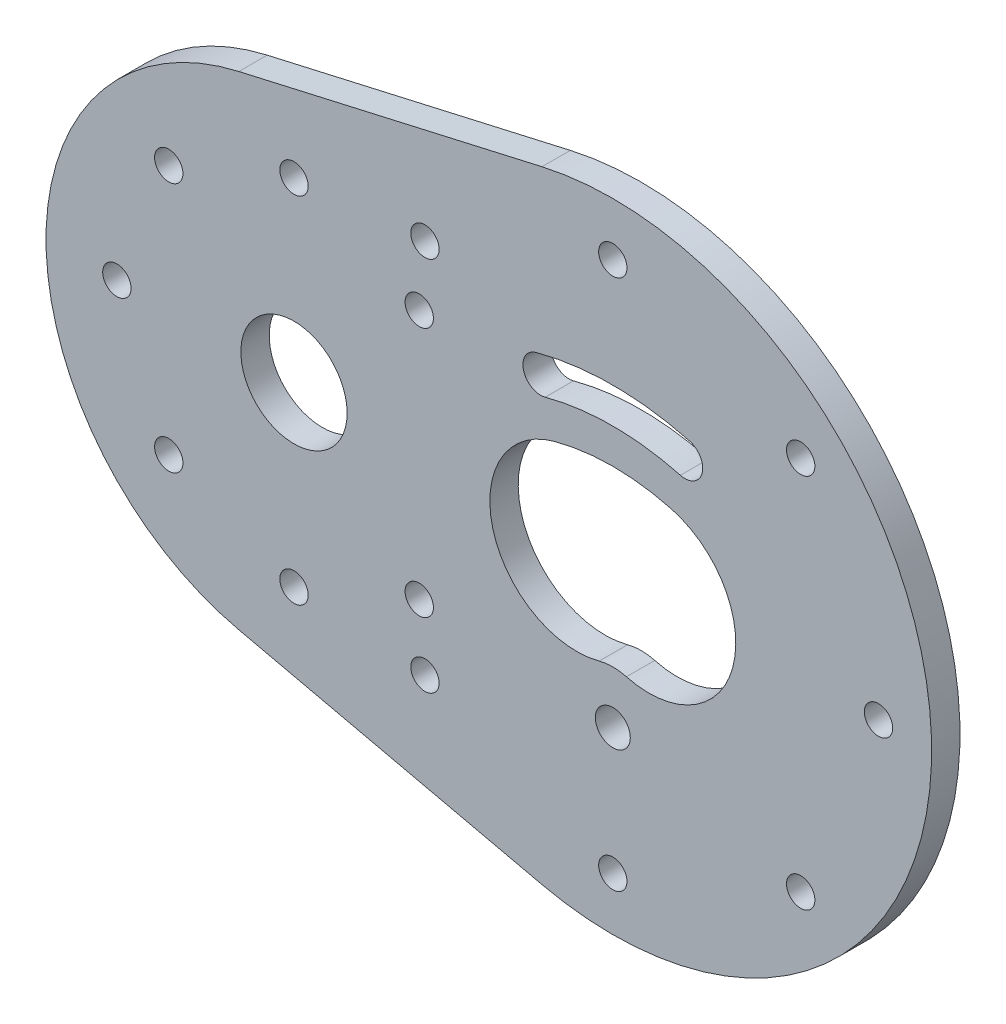
ISO-10303-21;
HEADER;
FILE_DESCRIPTION(('STEP AP214'),'2;1');
FILE_NAME('part.step','',(''),(''),'','','');
FILE_SCHEMA(('AUTOMOTIVE_DESIGN { 1 0 10303 214 1 1 1 1 }'));
ENDSEC;
DATA;
#1=APPLICATION_CONTEXT('core data for automotive mechanical design processes');
#2=APPLICATION_PROTOCOL_DEFINITION('international standard','automotive_design',2000,#1);
#3=PRODUCT_CONTEXT('',#1,'mechanical');
#4=PRODUCT('Part','Part','',(#3));
#5=PRODUCT_RELATED_PRODUCT_CATEGORY('part','',(#4));
#6=PRODUCT_DEFINITION_FORMATION('','',#4);
#7=PRODUCT_DEFINITION_CONTEXT('part definition',#1,'design');
#8=PRODUCT_DEFINITION('design','',#6,#7);
#9=PRODUCT_DEFINITION_SHAPE('','',#8);
#10=(LENGTH_UNIT() NAMED_UNIT(*) SI_UNIT(.MILLI.,.METRE.));
#11=(NAMED_UNIT(*) PLANE_ANGLE_UNIT() SI_UNIT($,.RADIAN.));
#12=(NAMED_UNIT(*) SI_UNIT($,.STERADIAN.) SOLID_ANGLE_UNIT());
#13=UNCERTAINTY_MEASURE_WITH_UNIT(LENGTH_MEASURE(1.E-05),#10,'distance_accuracy_value','');
#14=(GEOMETRIC_REPRESENTATION_CONTEXT(3) GLOBAL_UNCERTAINTY_ASSIGNED_CONTEXT((#13)) GLOBAL_UNIT_ASSIGNED_CONTEXT((#10,
#11,#12)) REPRESENTATION_CONTEXT('',''));
#15=CARTESIAN_POINT('',(0.,0.,0.));
#16=DIRECTION('',(0.,0.,1.));
#17=DIRECTION('',(1.,0.,0.));
#18=AXIS2_PLACEMENT_3D('',#15,#16,#17);
#19=CARTESIAN_POINT('',(35.4686704501793,-31.95,2.54));
#20=DIRECTION('',(0.,0.,1.));
#21=DIRECTION('',(1.,0.,0.));
#22=AXIS2_PLACEMENT_3D('',#19,#20,#21);
#23=PLANE('',#22);
#24=CARTESIAN_POINT('',(-16.8379802270047,29.3379802270047,2.54));
#25=DIRECTION('',(0.,0.,1.));
#26=DIRECTION('',(1.,0.,0.));
#27=AXIS2_PLACEMENT_3D('',#24,#25,#26);
#28=CIRCLE('',#27,1.27);
#29=CARTESIAN_POINT('',(-15.5679802270047,29.3379802270047,2.54));
#30=VERTEX_POINT('',#29);
#31=EDGE_CURVE('E332',#30,#30,#28,.T.);
#32=ORIENTED_EDGE('',*,*,#31,.F.);
#33=EDGE_LOOP('',(#32));
#34=FACE_BOUND('',#33,.T.);
#35=CARTESIAN_POINT('',(-16.8379802270047,-4.33798022700466,2.54));
#36=DIRECTION('',(0.,0.,1.));
#37=DIRECTION('',(1.,0.,0.));
#38=AXIS2_PLACEMENT_3D('',#35,#36,#37);
#39=CIRCLE('',#38,1.27000000000001);
#40=CARTESIAN_POINT('',(-15.5679802270046,-4.33798022700466,2.54));
#41=VERTEX_POINT('',#40);
#42=EDGE_CURVE('E326',#41,#41,#39,.T.);
#43=ORIENTED_EDGE('',*,*,#42,.F.);
#44=EDGE_LOOP('',(#43));
#45=FACE_BOUND('',#44,.T.);
#46=CARTESIAN_POINT('',(0.,-11.3125,2.54));
#47=DIRECTION('',(0.,0.,1.));
#48=DIRECTION('',(1.,0.,0.));
#49=AXIS2_PLACEMENT_3D('',#46,#47,#48);
#50=CIRCLE('',#49,1.27);
#51=CARTESIAN_POINT('',(1.27,-11.3125,2.54));
#52=VERTEX_POINT('',#51);
#53=EDGE_CURVE('E320',#52,#52,#50,.T.);
#54=ORIENTED_EDGE('',*,*,#53,.F.);
#55=EDGE_LOOP('',(#54));
#56=FACE_BOUND('',#55,.T.);
#57=CARTESIAN_POINT('',(16.8379802270047,-4.33798022700466,2.54));
#58=DIRECTION('',(0.,0.,1.));
#59=DIRECTION('',(1.,0.,0.));
#60=AXIS2_PLACEMENT_3D('',#57,#58,#59);
#61=CIRCLE('',#60,1.27);
#62=CARTESIAN_POINT('',(18.1079802270047,-4.33798022700466,2.54));
#63=VERTEX_POINT('',#62);
#64=EDGE_CURVE('E314',#63,#63,#61,.T.);
#65=ORIENTED_EDGE('',*,*,#64,.F.);
#66=EDGE_LOOP('',(#65));
#67=FACE_BOUND('',#66,.T.);
#68=CARTESIAN_POINT('',(23.8125,12.5,2.54));
#69=DIRECTION('',(0.,0.,1.));
#70=DIRECTION('',(1.,0.,0.));
#71=AXIS2_PLACEMENT_3D('',#68,#69,#70);
#72=CIRCLE('',#71,1.27);
#73=CARTESIAN_POINT('',(25.0825,12.5,2.54));
#74=VERTEX_POINT('',#73);
#75=EDGE_CURVE('E308',#74,#74,#72,.T.);
#76=ORIENTED_EDGE('',*,*,#75,.F.);
#77=EDGE_LOOP('',(#76));
#78=FACE_BOUND('',#77,.T.);
#79=CARTESIAN_POINT('',(16.8379802270047,29.3379802270047,2.54));
#80=DIRECTION('',(0.,0.,1.));
#81=DIRECTION('',(1.,0.,0.));
#82=AXIS2_PLACEMENT_3D('',#79,#80,#81);
#83=CIRCLE('',#82,1.27);
#84=CARTESIAN_POINT('',(18.1079802270047,29.3379802270047,2.54));
#85=VERTEX_POINT('',#84);
#86=EDGE_CURVE('E302',#85,#85,#83,.T.);
#87=ORIENTED_EDGE('',*,*,#86,.F.);
#88=EDGE_LOOP('',(#87));
#89=FACE_BOUND('',#88,.T.);
#90=CARTESIAN_POINT('',(-39.8003201513362,23.7253201513364,2.54));
#91=DIRECTION('',(0.,0.,1.));
#92=DIRECTION('',(1.,0.,0.));
#93=AXIS2_PLACEMENT_3D('',#90,#91,#92);
#94=CIRCLE('',#93,1.27);
#95=CARTESIAN_POINT('',(-38.5303201513362,23.7253201513364,2.54));
#96=VERTEX_POINT('',#95);
#97=EDGE_CURVE('E296',#96,#96,#94,.T.);
#98=ORIENTED_EDGE('',*,*,#97,.F.);
#99=EDGE_LOOP('',(#98));
#100=FACE_BOUND('',#99,.T.);
#101=CARTESIAN_POINT('',(-44.4499999999998,12.5,2.54));
#102=DIRECTION('',(0.,0.,1.));
#103=DIRECTION('',(1.,0.,0.));
#104=AXIS2_PLACEMENT_3D('',#101,#102,#103);
#105=CIRCLE('',#104,1.27);
#106=CARTESIAN_POINT('',(-43.1799999999998,12.5,2.54));
#107=VERTEX_POINT('',#106);
#108=EDGE_CURVE('E290',#107,#107,#105,.T.);
#109=ORIENTED_EDGE('',*,*,#108,.F.);
#110=EDGE_LOOP('',(#109));
#111=FACE_BOUND('',#110,.T.);
#112=CARTESIAN_POINT('',(-39.8003201513362,1.2746798486635,2.54));
#113=DIRECTION('',(0.,0.,1.));
#114=DIRECTION('',(1.,0.,0.));
#115=AXIS2_PLACEMENT_3D('',#112,#113,#114);
#116=CIRCLE('',#115,1.27);
#117=CARTESIAN_POINT('',(-38.5303201513362,1.2746798486635,2.54));
#118=VERTEX_POINT('',#117);
#119=EDGE_CURVE('E284',#118,#118,#116,.T.);
#120=ORIENTED_EDGE('',*,*,#119,.F.);
#121=EDGE_LOOP('',(#120));
#122=FACE_BOUND('',#121,.T.);
#123=CARTESIAN_POINT('',(-28.5749999999997,-3.375,2.54));
#124=DIRECTION('',(0.,0.,1.));
#125=DIRECTION('',(1.,0.,0.));
#126=AXIS2_PLACEMENT_3D('',#123,#124,#125);
#127=CIRCLE('',#126,1.27);
#128=CARTESIAN_POINT('',(-27.3049999999997,-3.375,2.54));
#129=VERTEX_POINT('',#128);
#130=EDGE_CURVE('E278',#129,#129,#127,.T.);
#131=ORIENTED_EDGE('',*,*,#130,.F.);
#132=EDGE_LOOP('',(#131));
#133=FACE_BOUND('',#132,.T.);
#134=CARTESIAN_POINT('',(-17.3496798486632,1.27467984866366,2.54));
#135=DIRECTION('',(0.,0.,1.));
#136=DIRECTION('',(1.,0.,0.));
#137=AXIS2_PLACEMENT_3D('',#134,#135,#136);
#138=CIRCLE('',#137,1.27);
#139=CARTESIAN_POINT('',(-16.0796798486632,1.27467984866366,2.54));
#140=VERTEX_POINT('',#139);
#141=EDGE_CURVE('E272',#140,#140,#138,.T.);
#142=ORIENTED_EDGE('',*,*,#141,.F.);
#143=EDGE_LOOP('',(#142));
#144=FACE_BOUND('',#143,.T.);
#145=CARTESIAN_POINT('',(-17.3496798486635,23.7253201513366,2.54));
#146=DIRECTION('',(0.,0.,1.));
#147=DIRECTION('',(1.,0.,0.));
#148=AXIS2_PLACEMENT_3D('',#145,#146,#147);
#149=CIRCLE('',#148,1.27000000000001);
#150=CARTESIAN_POINT('',(-16.0796798486635,23.7253201513366,2.54));
#151=VERTEX_POINT('',#150);
#152=EDGE_CURVE('E266',#151,#151,#149,.T.);
#153=ORIENTED_EDGE('',*,*,#152,.F.);
#154=EDGE_LOOP('',(#153));
#155=FACE_BOUND('',#154,.T.);
#156=CARTESIAN_POINT('',(0.,36.3125,2.54));
#157=DIRECTION('',(0.,0.,1.));
#158=DIRECTION('',(1.,0.,0.));
#159=AXIS2_PLACEMENT_3D('',#156,#157,#158);
#160=CIRCLE('',#159,1.27);
#161=CARTESIAN_POINT('',(1.27,36.3125,2.54));
#162=VERTEX_POINT('',#161);
#163=EDGE_CURVE('E260',#162,#162,#160,.T.);
#164=ORIENTED_EDGE('',*,*,#163,.F.);
#165=EDGE_LOOP('',(#164));
#166=FACE_BOUND('',#165,.T.);
#167=CARTESIAN_POINT('',(-28.575,28.375,2.54));
#168=DIRECTION('',(0.,0.,1.));
#169=DIRECTION('',(1.,0.,0.));
#170=AXIS2_PLACEMENT_3D('',#167,#168,#169);
#171=CIRCLE('',#170,1.27);
#172=CARTESIAN_POINT('',(-27.305,28.375,2.54));
#173=VERTEX_POINT('',#172);
#174=EDGE_CURVE('E254',#173,#173,#171,.T.);
#175=ORIENTED_EDGE('',*,*,#174,.F.);
#176=EDGE_LOOP('',(#175));
#177=FACE_BOUND('',#176,.T.);
#178=CARTESIAN_POINT('',(-28.575,12.5,2.54));
#179=DIRECTION('',(0.,0.,1.));
#180=DIRECTION('',(1.,0.,0.));
#181=AXIS2_PLACEMENT_3D('',#178,#179,#180);
#182=CIRCLE('',#181,4.7625);
#183=CARTESIAN_POINT('',(-23.8125,12.5,2.54));
#184=VERTEX_POINT('',#183);
#185=EDGE_CURVE('E154',#184,#184,#182,.T.);
#186=ORIENTED_EDGE('',*,*,#185,.F.);
#187=EDGE_LOOP('',(#186));
#188=FACE_BOUND('',#187,.T.);
#189=CARTESIAN_POINT('',(0.,0.,2.54));
#190=DIRECTION('',(0.,0.,1.));
#191=DIRECTION('',(1.,0.,0.));
#192=AXIS2_PLACEMENT_3D('',#189,#190,#191);
#193=CIRCLE('',#192,1.56488027551501);
#194=CARTESIAN_POINT('',(1.56488027551501,0.,2.54));
#195=VERTEX_POINT('',#194);
#196=EDGE_CURVE('E191',#195,#195,#193,.T.);
#197=ORIENTED_EDGE('',*,*,#196,.F.);
#198=EDGE_LOOP('',(#197));
#199=FACE_BOUND('',#198,.T.);
#200=CARTESIAN_POINT('',(3.23523806378152,12.0740728286134,2.54));
#201=DIRECTION('',(0.,0.,1.));
#202=DIRECTION('',(-1.,0.,0.));
#203=AXIS2_PLACEMENT_3D('',#200,#201,#202);
#204=CIRCLE('',#203,7.7851);
#205=CARTESIAN_POINT('',(1.22030591575388,4.55424367837033,2.54));
#206=VERTEX_POINT('',#205);
#207=CARTESIAN_POINT('',(5.25017021180916,19.5939019788564,2.54));
#208=VERTEX_POINT('',#207);
#209=EDGE_CURVE('E199',#206,#208,#204,.T.);
#210=ORIENTED_EDGE('',*,*,#209,.F.);
#211=CARTESIAN_POINT('',(0.,0.,2.54));
#212=DIRECTION('',(0.,0.,-1.));
#213=DIRECTION('',(1.,0.,0.));
#214=AXIS2_PLACEMENT_3D('',#211,#212,#213);
#215=CIRCLE('',#214,4.7149);
#216=CARTESIAN_POINT('',(-1.22030591575388,4.55424367837033,2.54));
#217=VERTEX_POINT('',#216);
#218=EDGE_CURVE('E197',#217,#206,#215,.T.);
#219=ORIENTED_EDGE('',*,*,#218,.F.);
#220=CARTESIAN_POINT('',(-3.23523806378152,12.0740728286134,2.54));
#221=DIRECTION('',(0.,0.,1.));
#222=DIRECTION('',(1.,0.,0.));
#223=AXIS2_PLACEMENT_3D('',#220,#221,#222);
#224=CIRCLE('',#223,7.7851);
#225=CARTESIAN_POINT('',(-5.25017021180916,19.5939019788564,2.54));
#226=VERTEX_POINT('',#225);
#227=EDGE_CURVE('E205',#226,#217,#224,.T.);
#228=ORIENTED_EDGE('',*,*,#227,.F.);
#229=CARTESIAN_POINT('',(0.,0.,2.54));
#230=DIRECTION('',(0.,0.,1.));
#231=DIRECTION('',(1.,0.,0.));
#232=AXIS2_PLACEMENT_3D('',#229,#230,#231);
#233=CIRCLE('',#232,20.2851);
#234=EDGE_CURVE('E202',#208,#226,#233,.T.);
#235=ORIENTED_EDGE('',*,*,#234,.F.);
#236=EDGE_LOOP('',(#210,#219,#228,#235));
#237=FACE_BOUND('',#236,.T.);
#238=CARTESIAN_POINT('',(0.,0.,2.54));
#239=DIRECTION('',(0.,0.,-1.));
#240=DIRECTION('',(1.,0.,0.));
#241=AXIS2_PLACEMENT_3D('',#238,#239,#240);
#242=CIRCLE('',#241,23.4125);
#243=CARTESIAN_POINT('',(-6.05960089346279,22.6147384079928,2.54));
#244=VERTEX_POINT('',#243);
#245=CARTESIAN_POINT('',(6.05960089346279,22.6147384079928,2.54));
#246=VERTEX_POINT('',#245);
#247=EDGE_CURVE('E162',#244,#246,#242,.T.);
#248=ORIENTED_EDGE('',*,*,#247,.F.);
#249=CARTESIAN_POINT('',(-6.47047612756304,24.1481456572267,2.54));
#250=DIRECTION('',(0.,0.,1.));
#251=DIRECTION('',(1.,0.,0.));
#252=AXIS2_PLACEMENT_3D('',#249,#250,#251);
#253=CIRCLE('',#252,1.5875);
#254=CARTESIAN_POINT('',(-6.88135136166329,25.6815529064606,2.54));
#255=VERTEX_POINT('',#254);
#256=EDGE_CURVE('E160',#255,#244,#253,.T.);
#257=ORIENTED_EDGE('',*,*,#256,.F.);
#258=CARTESIAN_POINT('',(0.,0.,2.54));
#259=DIRECTION('',(0.,0.,1.));
#260=DIRECTION('',(1.,0.,0.));
#261=AXIS2_PLACEMENT_3D('',#258,#259,#260);
#262=CIRCLE('',#261,26.5875);
#263=CARTESIAN_POINT('',(6.88135136166329,25.6815529064606,2.54));
#264=VERTEX_POINT('',#263);
#265=EDGE_CURVE('E168',#264,#255,#262,.T.);
#266=ORIENTED_EDGE('',*,*,#265,.F.);
#267=CARTESIAN_POINT('',(6.47047612756304,24.1481456572267,2.54));
#268=DIRECTION('',(0.,0.,1.));
#269=DIRECTION('',(-1.,0.,0.));
#270=AXIS2_PLACEMENT_3D('',#267,#268,#269);
#271=CIRCLE('',#270,1.5875);
#272=EDGE_CURVE('E165',#246,#264,#271,.T.);
#273=ORIENTED_EDGE('',*,*,#272,.F.);
#274=EDGE_LOOP('',(#248,#257,#266,#273));
#275=FACE_BOUND('',#274,.T.);
#276=DIRECTION('',(-0.974996043043569,-0.222222222222222,0.));
#277=VECTOR('',#276,1.);
#278=CARTESIAN_POINT('',(-33.5138888888889,34.1692870566433,2.54));
#279=LINE('',#278,#277);
#280=CARTESIAN_POINT('',(-6.35000000000002,40.36051192997,2.54));
#281=VERTEX_POINT('',#280);
#282=CARTESIAN_POINT('',(-33.5138888888889,34.1692870566433,2.54));
#283=VERTEX_POINT('',#282);
#284=EDGE_CURVE('E125',#281,#283,#279,.T.);
#285=ORIENTED_EDGE('',*,*,#284,.T.);
#286=CARTESIAN_POINT('',(-28.575,12.5,2.54));
#287=DIRECTION('',(0.,0.,1.));
#288=DIRECTION('',(1.,0.,0.));
#289=AXIS2_PLACEMENT_3D('',#286,#287,#288);
#290=CIRCLE('',#289,22.225);
#291=CARTESIAN_POINT('',(-33.5138888888889,-9.16928705664331,2.54));
#292=VERTEX_POINT('',#291);
#293=EDGE_CURVE('E142',#283,#292,#290,.T.);
#294=ORIENTED_EDGE('',*,*,#293,.T.);
#295=DIRECTION('',(0.974996043043569,-0.222222222222222,0.));
#296=VECTOR('',#295,1.);
#297=CARTESIAN_POINT('',(-33.5138888888889,-9.16928705664331,2.54));
#298=LINE('',#297,#296);
#299=CARTESIAN_POINT('',(-6.34999999999999,-15.36051192997,2.54));
#300=VERTEX_POINT('',#299);
#301=EDGE_CURVE('E145',#292,#300,#298,.T.);
#302=ORIENTED_EDGE('',*,*,#301,.T.);
#303=CARTESIAN_POINT('',(0.,12.5,2.54));
#304=DIRECTION('',(0.,0.,1.));
#305=DIRECTION('',(1.,0.,0.));
#306=AXIS2_PLACEMENT_3D('',#303,#304,#305);
#307=CIRCLE('',#306,28.575);
#308=EDGE_CURVE('E45',#300,#281,#307,.T.);
#309=ORIENTED_EDGE('',*,*,#308,.T.);
#310=EDGE_LOOP('',(#285,#294,#302,#309));
#311=FACE_BOUND('',#310,.T.);
#312=ADVANCED_FACE('F30',(#34,#45,#56,#67,#78,#89,#100,#111,#122,#133,#144,#155,#166,#177,#188,
#199,#237,#275,#311),#23,.T.);
#313=CARTESIAN_POINT('',(35.4686704501793,-31.95,0.));
#314=DIRECTION('',(0.,0.,1.));
#315=DIRECTION('',(1.,0.,0.));
#316=AXIS2_PLACEMENT_3D('',#313,#314,#315);
#317=PLANE('',#316);
#318=CARTESIAN_POINT('',(-16.8379802270047,29.3379802270047,0.));
#319=DIRECTION('',(0.,0.,1.));
#320=DIRECTION('',(1.,0.,0.));
#321=AXIS2_PLACEMENT_3D('',#318,#319,#320);
#322=CIRCLE('',#321,1.27);
#323=CARTESIAN_POINT('',(-15.5679802270047,29.3379802270047,0.));
#324=VERTEX_POINT('',#323);
#325=EDGE_CURVE('E329',#324,#324,#322,.T.);
#326=ORIENTED_EDGE('',*,*,#325,.T.);
#327=EDGE_LOOP('',(#326));
#328=FACE_BOUND('',#327,.T.);
#329=CARTESIAN_POINT('',(-16.8379802270047,-4.33798022700466,0.));
#330=DIRECTION('',(0.,0.,1.));
#331=DIRECTION('',(1.,0.,0.));
#332=AXIS2_PLACEMENT_3D('',#329,#330,#331);
#333=CIRCLE('',#332,1.27000000000001);
#334=CARTESIAN_POINT('',(-15.5679802270046,-4.33798022700466,0.));
#335=VERTEX_POINT('',#334);
#336=EDGE_CURVE('E323',#335,#335,#333,.T.);
#337=ORIENTED_EDGE('',*,*,#336,.T.);
#338=EDGE_LOOP('',(#337));
#339=FACE_BOUND('',#338,.T.);
#340=CARTESIAN_POINT('',(0.,-11.3125,0.));
#341=DIRECTION('',(0.,0.,1.));
#342=DIRECTION('',(1.,0.,0.));
#343=AXIS2_PLACEMENT_3D('',#340,#341,#342);
#344=CIRCLE('',#343,1.27);
#345=CARTESIAN_POINT('',(1.27,-11.3125,0.));
#346=VERTEX_POINT('',#345);
#347=EDGE_CURVE('E317',#346,#346,#344,.T.);
#348=ORIENTED_EDGE('',*,*,#347,.T.);
#349=EDGE_LOOP('',(#348));
#350=FACE_BOUND('',#349,.T.);
#351=CARTESIAN_POINT('',(16.8379802270047,-4.33798022700466,0.));
#352=DIRECTION('',(0.,0.,1.));
#353=DIRECTION('',(1.,0.,0.));
#354=AXIS2_PLACEMENT_3D('',#351,#352,#353);
#355=CIRCLE('',#354,1.27);
#356=CARTESIAN_POINT('',(18.1079802270047,-4.33798022700466,0.));
#357=VERTEX_POINT('',#356);
#358=EDGE_CURVE('E311',#357,#357,#355,.T.);
#359=ORIENTED_EDGE('',*,*,#358,.T.);
#360=EDGE_LOOP('',(#359));
#361=FACE_BOUND('',#360,.T.);
#362=CARTESIAN_POINT('',(23.8125,12.5,0.));
#363=DIRECTION('',(0.,0.,1.));
#364=DIRECTION('',(1.,0.,0.));
#365=AXIS2_PLACEMENT_3D('',#362,#363,#364);
#366=CIRCLE('',#365,1.27);
#367=CARTESIAN_POINT('',(25.0825,12.5,0.));
#368=VERTEX_POINT('',#367);
#369=EDGE_CURVE('E305',#368,#368,#366,.T.);
#370=ORIENTED_EDGE('',*,*,#369,.T.);
#371=EDGE_LOOP('',(#370));
#372=FACE_BOUND('',#371,.T.);
#373=CARTESIAN_POINT('',(16.8379802270047,29.3379802270047,0.));
#374=DIRECTION('',(0.,0.,1.));
#375=DIRECTION('',(1.,0.,0.));
#376=AXIS2_PLACEMENT_3D('',#373,#374,#375);
#377=CIRCLE('',#376,1.27);
#378=CARTESIAN_POINT('',(18.1079802270047,29.3379802270047,0.));
#379=VERTEX_POINT('',#378);
#380=EDGE_CURVE('E299',#379,#379,#377,.T.);
#381=ORIENTED_EDGE('',*,*,#380,.T.);
#382=EDGE_LOOP('',(#381));
#383=FACE_BOUND('',#382,.T.);
#384=CARTESIAN_POINT('',(-39.8003201513362,23.7253201513364,0.));
#385=DIRECTION('',(0.,0.,1.));
#386=DIRECTION('',(1.,0.,0.));
#387=AXIS2_PLACEMENT_3D('',#384,#385,#386);
#388=CIRCLE('',#387,1.27);
#389=CARTESIAN_POINT('',(-38.5303201513362,23.7253201513364,0.));
#390=VERTEX_POINT('',#389);
#391=EDGE_CURVE('E293',#390,#390,#388,.T.);
#392=ORIENTED_EDGE('',*,*,#391,.T.);
#393=EDGE_LOOP('',(#392));
#394=FACE_BOUND('',#393,.T.);
#395=CARTESIAN_POINT('',(-44.4499999999998,12.5,0.));
#396=DIRECTION('',(0.,0.,1.));
#397=DIRECTION('',(1.,0.,0.));
#398=AXIS2_PLACEMENT_3D('',#395,#396,#397);
#399=CIRCLE('',#398,1.27);
#400=CARTESIAN_POINT('',(-43.1799999999998,12.5,0.));
#401=VERTEX_POINT('',#400);
#402=EDGE_CURVE('E287',#401,#401,#399,.T.);
#403=ORIENTED_EDGE('',*,*,#402,.T.);
#404=EDGE_LOOP('',(#403));
#405=FACE_BOUND('',#404,.T.);
#406=CARTESIAN_POINT('',(-39.8003201513362,1.2746798486635,0.));
#407=DIRECTION('',(0.,0.,1.));
#408=DIRECTION('',(1.,0.,0.));
#409=AXIS2_PLACEMENT_3D('',#406,#407,#408);
#410=CIRCLE('',#409,1.27);
#411=CARTESIAN_POINT('',(-38.5303201513362,1.2746798486635,0.));
#412=VERTEX_POINT('',#411);
#413=EDGE_CURVE('E281',#412,#412,#410,.T.);
#414=ORIENTED_EDGE('',*,*,#413,.T.);
#415=EDGE_LOOP('',(#414));
#416=FACE_BOUND('',#415,.T.);
#417=CARTESIAN_POINT('',(-28.5749999999997,-3.375,0.));
#418=DIRECTION('',(0.,0.,1.));
#419=DIRECTION('',(1.,0.,0.));
#420=AXIS2_PLACEMENT_3D('',#417,#418,#419);
#421=CIRCLE('',#420,1.27);
#422=CARTESIAN_POINT('',(-27.3049999999997,-3.375,0.));
#423=VERTEX_POINT('',#422);
#424=EDGE_CURVE('E275',#423,#423,#421,.T.);
#425=ORIENTED_EDGE('',*,*,#424,.T.);
#426=EDGE_LOOP('',(#425));
#427=FACE_BOUND('',#426,.T.);
#428=CARTESIAN_POINT('',(-17.3496798486632,1.27467984866366,0.));
#429=DIRECTION('',(0.,0.,1.));
#430=DIRECTION('',(1.,0.,0.));
#431=AXIS2_PLACEMENT_3D('',#428,#429,#430);
#432=CIRCLE('',#431,1.27);
#433=CARTESIAN_POINT('',(-16.0796798486632,1.27467984866366,0.));
#434=VERTEX_POINT('',#433);
#435=EDGE_CURVE('E269',#434,#434,#432,.T.);
#436=ORIENTED_EDGE('',*,*,#435,.T.);
#437=EDGE_LOOP('',(#436));
#438=FACE_BOUND('',#437,.T.);
#439=CARTESIAN_POINT('',(-17.3496798486635,23.7253201513366,0.));
#440=DIRECTION('',(0.,0.,1.));
#441=DIRECTION('',(1.,0.,0.));
#442=AXIS2_PLACEMENT_3D('',#439,#440,#441);
#443=CIRCLE('',#442,1.27000000000001);
#444=CARTESIAN_POINT('',(-16.0796798486635,23.7253201513366,0.));
#445=VERTEX_POINT('',#444);
#446=EDGE_CURVE('E263',#445,#445,#443,.T.);
#447=ORIENTED_EDGE('',*,*,#446,.T.);
#448=EDGE_LOOP('',(#447));
#449=FACE_BOUND('',#448,.T.);
#450=CARTESIAN_POINT('',(0.,36.3125,0.));
#451=DIRECTION('',(0.,0.,1.));
#452=DIRECTION('',(1.,0.,0.));
#453=AXIS2_PLACEMENT_3D('',#450,#451,#452);
#454=CIRCLE('',#453,1.27);
#455=CARTESIAN_POINT('',(1.27,36.3125,0.));
#456=VERTEX_POINT('',#455);
#457=EDGE_CURVE('E257',#456,#456,#454,.T.);
#458=ORIENTED_EDGE('',*,*,#457,.T.);
#459=EDGE_LOOP('',(#458));
#460=FACE_BOUND('',#459,.T.);
#461=CARTESIAN_POINT('',(-28.575,28.375,0.));
#462=DIRECTION('',(0.,0.,1.));
#463=DIRECTION('',(1.,0.,0.));
#464=AXIS2_PLACEMENT_3D('',#461,#462,#463);
#465=CIRCLE('',#464,1.27);
#466=CARTESIAN_POINT('',(-27.305,28.375,0.));
#467=VERTEX_POINT('',#466);
#468=EDGE_CURVE('E146',#467,#467,#465,.T.);
#469=ORIENTED_EDGE('',*,*,#468,.T.);
#470=EDGE_LOOP('',(#469));
#471=FACE_BOUND('',#470,.T.);
#472=CARTESIAN_POINT('',(-28.575,12.5,0.));
#473=DIRECTION('',(0.,0.,1.));
#474=DIRECTION('',(1.,0.,0.));
#475=AXIS2_PLACEMENT_3D('',#472,#473,#474);
#476=CIRCLE('',#475,4.7625);
#477=CARTESIAN_POINT('',(-23.8125,12.5,0.));
#478=VERTEX_POINT('',#477);
#479=EDGE_CURVE('E151',#478,#478,#476,.T.);
#480=ORIENTED_EDGE('',*,*,#479,.T.);
#481=EDGE_LOOP('',(#480));
#482=FACE_BOUND('',#481,.T.);
#483=CARTESIAN_POINT('',(0.,0.,0.));
#484=DIRECTION('',(0.,0.,1.));
#485=DIRECTION('',(1.,0.,0.));
#486=AXIS2_PLACEMENT_3D('',#483,#484,#485);
#487=CIRCLE('',#486,1.56488027551501);
#488=CARTESIAN_POINT('',(1.56488027551501,0.,0.));
#489=VERTEX_POINT('',#488);
#490=EDGE_CURVE('E190',#489,#489,#487,.T.);
#491=ORIENTED_EDGE('',*,*,#490,.T.);
#492=EDGE_LOOP('',(#491));
#493=FACE_BOUND('',#492,.T.);
#494=CARTESIAN_POINT('',(0.,0.,0.));
#495=DIRECTION('',(0.,0.,-1.));
#496=DIRECTION('',(1.,0.,0.));
#497=AXIS2_PLACEMENT_3D('',#494,#495,#496);
#498=CIRCLE('',#497,4.7149);
#499=CARTESIAN_POINT('',(-1.22030591575388,4.55424367837033,0.));
#500=VERTEX_POINT('',#499);
#501=CARTESIAN_POINT('',(1.22030591575388,4.55424367837033,0.));
#502=VERTEX_POINT('',#501);
#503=EDGE_CURVE('E194',#500,#502,#498,.T.);
#504=ORIENTED_EDGE('',*,*,#503,.T.);
#505=CARTESIAN_POINT('',(3.23523806378152,12.0740728286134,0.));
#506=DIRECTION('',(0.,0.,1.));
#507=DIRECTION('',(-1.,0.,0.));
#508=AXIS2_PLACEMENT_3D('',#505,#506,#507);
#509=CIRCLE('',#508,7.7851);
#510=CARTESIAN_POINT('',(5.25017021180916,19.5939019788564,0.));
#511=VERTEX_POINT('',#510);
#512=EDGE_CURVE('E210',#502,#511,#509,.T.);
#513=ORIENTED_EDGE('',*,*,#512,.T.);
#514=CARTESIAN_POINT('',(0.,0.,0.));
#515=DIRECTION('',(0.,0.,1.));
#516=DIRECTION('',(1.,0.,0.));
#517=AXIS2_PLACEMENT_3D('',#514,#515,#516);
#518=CIRCLE('',#517,20.2851);
#519=CARTESIAN_POINT('',(-5.25017021180916,19.5939019788564,0.));
#520=VERTEX_POINT('',#519);
#521=EDGE_CURVE('E213',#511,#520,#518,.T.);
#522=ORIENTED_EDGE('',*,*,#521,.T.);
#523=CARTESIAN_POINT('',(-3.23523806378152,12.0740728286134,0.));
#524=DIRECTION('',(0.,0.,1.));
#525=DIRECTION('',(1.,0.,0.));
#526=AXIS2_PLACEMENT_3D('',#523,#524,#525);
#527=CIRCLE('',#526,7.7851);
#528=EDGE_CURVE('E200',#520,#500,#527,.T.);
#529=ORIENTED_EDGE('',*,*,#528,.T.);
#530=EDGE_LOOP('',(#504,#513,#522,#529));
#531=FACE_BOUND('',#530,.T.);
#532=CARTESIAN_POINT('',(-6.47047612756304,24.1481456572267,0.));
#533=DIRECTION('',(0.,0.,1.));
#534=DIRECTION('',(1.,0.,0.));
#535=AXIS2_PLACEMENT_3D('',#532,#533,#534);
#536=CIRCLE('',#535,1.5875);
#537=CARTESIAN_POINT('',(-6.88135136166329,25.6815529064606,0.));
#538=VERTEX_POINT('',#537);
#539=CARTESIAN_POINT('',(-6.05960089346279,22.6147384079928,0.));
#540=VERTEX_POINT('',#539);
#541=EDGE_CURVE('E157',#538,#540,#536,.T.);
#542=ORIENTED_EDGE('',*,*,#541,.T.);
#543=CARTESIAN_POINT('',(0.,0.,0.));
#544=DIRECTION('',(0.,0.,-1.));
#545=DIRECTION('',(1.,0.,0.));
#546=AXIS2_PLACEMENT_3D('',#543,#544,#545);
#547=CIRCLE('',#546,23.4125);
#548=CARTESIAN_POINT('',(6.05960089346279,22.6147384079928,0.));
#549=VERTEX_POINT('',#548);
#550=EDGE_CURVE('E173',#540,#549,#547,.T.);
#551=ORIENTED_EDGE('',*,*,#550,.T.);
#552=CARTESIAN_POINT('',(6.47047612756304,24.1481456572267,0.));
#553=DIRECTION('',(0.,0.,1.));
#554=DIRECTION('',(-1.,0.,0.));
#555=AXIS2_PLACEMENT_3D('',#552,#553,#554);
#556=CIRCLE('',#555,1.5875);
#557=CARTESIAN_POINT('',(6.88135136166329,25.6815529064606,0.));
#558=VERTEX_POINT('',#557);
#559=EDGE_CURVE('E176',#549,#558,#556,.T.);
#560=ORIENTED_EDGE('',*,*,#559,.T.);
#561=CARTESIAN_POINT('',(0.,0.,0.));
#562=DIRECTION('',(0.,0.,1.));
#563=DIRECTION('',(1.,0.,0.));
#564=AXIS2_PLACEMENT_3D('',#561,#562,#563);
#565=CIRCLE('',#564,26.5875);
#566=EDGE_CURVE('E163',#558,#538,#565,.T.);
#567=ORIENTED_EDGE('',*,*,#566,.T.);
#568=EDGE_LOOP('',(#542,#551,#560,#567));
#569=FACE_BOUND('',#568,.T.);
#570=CARTESIAN_POINT('',(-28.575,12.5,0.));
#571=DIRECTION('',(0.,0.,1.));
#572=DIRECTION('',(1.,0.,0.));
#573=AXIS2_PLACEMENT_3D('',#570,#571,#572);
#574=CIRCLE('',#573,22.225);
#575=CARTESIAN_POINT('',(-33.5138888888889,34.1692870566433,0.));
#576=VERTEX_POINT('',#575);
#577=CARTESIAN_POINT('',(-33.5138888888889,-9.16928705664331,0.));
#578=VERTEX_POINT('',#577);
#579=EDGE_CURVE('E53',#576,#578,#574,.T.);
#580=ORIENTED_EDGE('',*,*,#579,.F.);
#581=DIRECTION('',(-0.974996043043569,-0.222222222222222,0.));
#582=VECTOR('',#581,1.);
#583=CARTESIAN_POINT('',(-33.5138888888889,34.1692870566433,0.));
#584=LINE('',#583,#582);
#585=CARTESIAN_POINT('',(-6.35000000000002,40.36051192997,0.));
#586=VERTEX_POINT('',#585);
#587=EDGE_CURVE('E123',#586,#576,#584,.T.);
#588=ORIENTED_EDGE('',*,*,#587,.F.);
#589=CARTESIAN_POINT('',(0.,12.5,0.));
#590=DIRECTION('',(0.,0.,1.));
#591=DIRECTION('',(1.,0.,0.));
#592=AXIS2_PLACEMENT_3D('',#589,#590,#591);
#593=CIRCLE('',#592,28.575);
#594=CARTESIAN_POINT('',(-6.35000000000001,-15.36051192997,0.));
#595=VERTEX_POINT('',#594);
#596=EDGE_CURVE('E130',#595,#586,#593,.T.);
#597=ORIENTED_EDGE('',*,*,#596,.F.);
#598=DIRECTION('',(0.974996043043569,-0.222222222222222,0.));
#599=VECTOR('',#598,1.);
#600=CARTESIAN_POINT('',(-33.5138888888889,-9.16928705664331,0.));
#601=LINE('',#600,#599);
#602=EDGE_CURVE('E135',#578,#595,#601,.T.);
#603=ORIENTED_EDGE('',*,*,#602,.F.);
#604=EDGE_LOOP('',(#580,#588,#597,#603));
#605=FACE_BOUND('',#604,.T.);
#606=ADVANCED_FACE('F32',(#328,#339,#350,#361,#372,#383,#394,#405,#416,#427,#438,#449,#460,#471,
#482,#493,#531,#569,#605),#317,.F.);
#607=CARTESIAN_POINT('',(0.,0.,2.54));
#608=DIRECTION('',(0.,0.,-1.));
#609=DIRECTION('',(-1.,0.,0.));
#610=AXIS2_PLACEMENT_3D('',#607,#608,#609);
#611=CYLINDRICAL_SURFACE('',#610,4.7149);
#612=ORIENTED_EDGE('',*,*,#503,.F.);
#613=DIRECTION('',(0.,0.,-1.));
#614=VECTOR('',#613,1.);
#615=CARTESIAN_POINT('',(-1.22030591575388,4.55424367837033,2.54));
#616=LINE('',#615,#614);
#617=EDGE_CURVE('E207',#217,#500,#616,.T.);
#618=ORIENTED_EDGE('',*,*,#617,.F.);
#619=ORIENTED_EDGE('',*,*,#218,.T.);
#620=DIRECTION('',(0.,0.,-1.));
#621=VECTOR('',#620,1.);
#622=CARTESIAN_POINT('',(1.22030591575388,4.55424367837033,2.54));
#623=LINE('',#622,#621);
#624=EDGE_CURVE('E11',#206,#502,#623,.T.);
#625=ORIENTED_EDGE('',*,*,#624,.T.);
#626=EDGE_LOOP('',(#612,#618,#619,#625));
#627=FACE_BOUND('',#626,.T.);
#628=ADVANCED_FACE('F235',(#627),#611,.T.);
#629=CARTESIAN_POINT('',(3.23523806378152,12.0740728286134,2.54));
#630=DIRECTION('',(0.,0.,-1.));
#631=DIRECTION('',(-1.,0.,0.));
#632=AXIS2_PLACEMENT_3D('',#629,#630,#631);
#633=CYLINDRICAL_SURFACE('',#632,7.7851);
#634=ORIENTED_EDGE('',*,*,#512,.F.);
#635=ORIENTED_EDGE('',*,*,#624,.F.);
#636=ORIENTED_EDGE('',*,*,#209,.T.);
#637=DIRECTION('',(0.,0.,-1.));
#638=VECTOR('',#637,1.);
#639=CARTESIAN_POINT('',(5.25017021180916,19.5939019788564,2.54));
#640=LINE('',#639,#638);
#641=EDGE_CURVE('E38',#208,#511,#640,.T.);
#642=ORIENTED_EDGE('',*,*,#641,.T.);
#643=EDGE_LOOP('',(#634,#635,#636,#642));
#644=FACE_BOUND('',#643,.T.);
#645=ADVANCED_FACE('F224',(#644),#633,.F.);
#646=CARTESIAN_POINT('',(0.,0.,2.54));
#647=DIRECTION('',(0.,0.,-1.));
#648=DIRECTION('',(-1.,0.,0.));
#649=AXIS2_PLACEMENT_3D('',#646,#647,#648);
#650=CYLINDRICAL_SURFACE('',#649,20.2851);
#651=ORIENTED_EDGE('',*,*,#521,.F.);
#652=ORIENTED_EDGE('',*,*,#641,.F.);
#653=ORIENTED_EDGE('',*,*,#234,.T.);
#654=DIRECTION('',(0.,0.,-1.));
#655=VECTOR('',#654,1.);
#656=CARTESIAN_POINT('',(-5.25017021180916,19.5939019788564,2.54));
#657=LINE('',#656,#655);
#658=EDGE_CURVE('E220',#226,#520,#657,.T.);
#659=ORIENTED_EDGE('',*,*,#658,.T.);
#660=EDGE_LOOP('',(#651,#652,#653,#659));
#661=FACE_BOUND('',#660,.T.);
#662=ADVANCED_FACE('F229',(#661),#650,.F.);
#663=CARTESIAN_POINT('',(-3.23523806378152,12.0740728286134,2.54));
#664=DIRECTION('',(0.,0.,-1.));
#665=DIRECTION('',(-1.,0.,0.));
#666=AXIS2_PLACEMENT_3D('',#663,#664,#665);
#667=CYLINDRICAL_SURFACE('',#666,7.7851);
#668=ORIENTED_EDGE('',*,*,#528,.F.);
#669=ORIENTED_EDGE('',*,*,#658,.F.);
#670=ORIENTED_EDGE('',*,*,#227,.T.);
#671=ORIENTED_EDGE('',*,*,#617,.T.);
#672=EDGE_LOOP('',(#668,#669,#670,#671));
#673=FACE_BOUND('',#672,.T.);
#674=ADVANCED_FACE('F238',(#673),#667,.F.);
#675=CARTESIAN_POINT('',(0.,0.,2.54));
#676=DIRECTION('',(0.,0.,-1.));
#677=DIRECTION('',(-1.,0.,0.));
#678=AXIS2_PLACEMENT_3D('',#675,#676,#677);
#679=CYLINDRICAL_SURFACE('',#678,1.56488027551501);
#680=ORIENTED_EDGE('',*,*,#196,.T.);
#681=EDGE_LOOP('',(#680));
#682=FACE_BOUND('',#681,.T.);
#683=ORIENTED_EDGE('',*,*,#490,.F.);
#684=EDGE_LOOP('',(#683));
#685=FACE_BOUND('',#684,.T.);
#686=ADVANCED_FACE('F377',(#682,#685),#679,.F.);
#687=CARTESIAN_POINT('',(-6.47047612756304,24.1481456572267,2.54));
#688=DIRECTION('',(0.,0.,-1.));
#689=DIRECTION('',(-1.,0.,0.));
#690=AXIS2_PLACEMENT_3D('',#687,#688,#689);
#691=CYLINDRICAL_SURFACE('',#690,1.5875);
#692=ORIENTED_EDGE('',*,*,#541,.F.);
#693=DIRECTION('',(0.,0.,-1.));
#694=VECTOR('',#693,1.);
#695=CARTESIAN_POINT('',(-6.88135136166329,25.6815529064606,2.54));
#696=LINE('',#695,#694);
#697=EDGE_CURVE('E170',#255,#538,#696,.T.);
#698=ORIENTED_EDGE('',*,*,#697,.F.);
#699=ORIENTED_EDGE('',*,*,#256,.T.);
#700=DIRECTION('',(0.,0.,-1.));
#701=VECTOR('',#700,1.);
#702=CARTESIAN_POINT('',(-6.05960089346279,22.6147384079928,2.54));
#703=LINE('',#702,#701);
#704=EDGE_CURVE('E187',#244,#540,#703,.T.);
#705=ORIENTED_EDGE('',*,*,#704,.T.);
#706=EDGE_LOOP('',(#692,#698,#699,#705));
#707=FACE_BOUND('',#706,.T.);
#708=ADVANCED_FACE('F380',(#707),#691,.F.);
#709=CARTESIAN_POINT('',(0.,0.,2.54));
#710=DIRECTION('',(0.,0.,-1.));
#711=DIRECTION('',(-1.,0.,0.));
#712=AXIS2_PLACEMENT_3D('',#709,#710,#711);
#713=CYLINDRICAL_SURFACE('',#712,23.4125);
#714=ORIENTED_EDGE('',*,*,#550,.F.);
#715=ORIENTED_EDGE('',*,*,#704,.F.);
#716=ORIENTED_EDGE('',*,*,#247,.T.);
#717=DIRECTION('',(0.,0.,-1.));
#718=VECTOR('',#717,1.);
#719=CARTESIAN_POINT('',(6.05960089346279,22.6147384079928,2.54));
#720=LINE('',#719,#718);
#721=EDGE_CURVE('E185',#246,#549,#720,.T.);
#722=ORIENTED_EDGE('',*,*,#721,.T.);
#723=EDGE_LOOP('',(#714,#715,#716,#722));
#724=FACE_BOUND('',#723,.T.);
#725=ADVANCED_FACE('F400',(#724),#713,.T.);
#726=CARTESIAN_POINT('',(6.47047612756304,24.1481456572267,2.54));
#727=DIRECTION('',(0.,0.,-1.));
#728=DIRECTION('',(-1.,0.,0.));
#729=AXIS2_PLACEMENT_3D('',#726,#727,#728);
#730=CYLINDRICAL_SURFACE('',#729,1.5875);
#731=ORIENTED_EDGE('',*,*,#559,.F.);
#732=ORIENTED_EDGE('',*,*,#721,.F.);
#733=ORIENTED_EDGE('',*,*,#272,.T.);
#734=DIRECTION('',(0.,0.,-1.));
#735=VECTOR('',#734,1.);
#736=CARTESIAN_POINT('',(6.88135136166329,25.6815529064606,2.54));
#737=LINE('',#736,#735);
#738=EDGE_CURVE('E183',#264,#558,#737,.T.);
#739=ORIENTED_EDGE('',*,*,#738,.T.);
#740=EDGE_LOOP('',(#731,#732,#733,#739));
#741=FACE_BOUND('',#740,.T.);
#742=ADVANCED_FACE('F404',(#741),#730,.F.);
#743=CARTESIAN_POINT('',(0.,0.,2.54));
#744=DIRECTION('',(0.,0.,-1.));
#745=DIRECTION('',(-1.,0.,0.));
#746=AXIS2_PLACEMENT_3D('',#743,#744,#745);
#747=CYLINDRICAL_SURFACE('',#746,26.5875);
#748=ORIENTED_EDGE('',*,*,#566,.F.);
#749=ORIENTED_EDGE('',*,*,#738,.F.);
#750=ORIENTED_EDGE('',*,*,#265,.T.);
#751=ORIENTED_EDGE('',*,*,#697,.T.);
#752=EDGE_LOOP('',(#748,#749,#750,#751));
#753=FACE_BOUND('',#752,.T.);
#754=ADVANCED_FACE('F408',(#753),#747,.F.);
#755=CARTESIAN_POINT('',(-28.575,12.5,2.54));
#756=DIRECTION('',(0.,0.,-1.));
#757=DIRECTION('',(-1.,0.,0.));
#758=AXIS2_PLACEMENT_3D('',#755,#756,#757);
#759=CYLINDRICAL_SURFACE('',#758,4.7625);
#760=ORIENTED_EDGE('',*,*,#185,.T.);
#761=EDGE_LOOP('',(#760));
#762=FACE_BOUND('',#761,.T.);
#763=ORIENTED_EDGE('',*,*,#479,.F.);
#764=EDGE_LOOP('',(#763));
#765=FACE_BOUND('',#764,.T.);
#766=ADVANCED_FACE('F412',(#762,#765),#759,.F.);
#767=CARTESIAN_POINT('',(-28.575,12.5,0.));
#768=DIRECTION('',(0.,0.,1.));
#769=DIRECTION('',(1.,0.,0.));
#770=AXIS2_PLACEMENT_3D('',#767,#768,#769);
#771=CYLINDRICAL_SURFACE('',#770,22.225);
#772=ORIENTED_EDGE('',*,*,#293,.F.);
#773=DIRECTION('',(0.,0.,1.));
#774=VECTOR('',#773,1.);
#775=CARTESIAN_POINT('',(-33.5138888888889,34.1692870566433,0.));
#776=LINE('',#775,#774);
#777=EDGE_CURVE('E126',#576,#283,#776,.T.);
#778=ORIENTED_EDGE('',*,*,#777,.F.);
#779=ORIENTED_EDGE('',*,*,#579,.T.);
#780=DIRECTION('',(0.,0.,1.));
#781=VECTOR('',#780,1.);
#782=CARTESIAN_POINT('',(-33.5138888888889,-9.16928705664331,0.));
#783=LINE('',#782,#781);
#784=EDGE_CURVE('E137',#578,#292,#783,.T.);
#785=ORIENTED_EDGE('',*,*,#784,.T.);
#786=EDGE_LOOP('',(#772,#778,#779,#785));
#787=FACE_BOUND('',#786,.T.);
#788=ADVANCED_FACE('F416',(#787),#771,.T.);
#789=CARTESIAN_POINT('',(-33.5138888888889,34.1692870566433,0.));
#790=DIRECTION('',(-0.222222222222222,0.974996043043569,0.));
#791=DIRECTION('',(-0.974996043043569,-0.222222222222222,0.));
#792=AXIS2_PLACEMENT_3D('',#789,#790,#791);
#793=PLANE('',#792);
#794=ORIENTED_EDGE('',*,*,#284,.F.);
#795=DIRECTION('',(0.,0.,1.));
#796=VECTOR('',#795,1.);
#797=CARTESIAN_POINT('',(-6.35000000000002,40.36051192997,0.));
#798=LINE('',#797,#796);
#799=EDGE_CURVE('E119',#586,#281,#798,.T.);
#800=ORIENTED_EDGE('',*,*,#799,.F.);
#801=ORIENTED_EDGE('',*,*,#587,.T.);
#802=ORIENTED_EDGE('',*,*,#777,.T.);
#803=EDGE_LOOP('',(#794,#800,#801,#802));
#804=FACE_BOUND('',#803,.T.);
#805=ADVANCED_FACE('F121',(#804),#793,.T.);
#806=CARTESIAN_POINT('',(0.,12.5,0.));
#807=DIRECTION('',(0.,0.,1.));
#808=DIRECTION('',(1.,0.,0.));
#809=AXIS2_PLACEMENT_3D('',#806,#807,#808);
#810=CYLINDRICAL_SURFACE('',#809,28.575);
#811=ORIENTED_EDGE('',*,*,#308,.F.);
#812=DIRECTION('',(0.,0.,1.));
#813=VECTOR('',#812,1.);
#814=CARTESIAN_POINT('',(-6.35,-15.36051192997,0.));
#815=LINE('',#814,#813);
#816=EDGE_CURVE('E127',#595,#300,#815,.T.);
#817=ORIENTED_EDGE('',*,*,#816,.F.);
#818=ORIENTED_EDGE('',*,*,#596,.T.);
#819=ORIENTED_EDGE('',*,*,#799,.T.);
#820=EDGE_LOOP('',(#811,#817,#818,#819));
#821=FACE_BOUND('',#820,.T.);
#822=ADVANCED_FACE('F131',(#821),#810,.T.);
#823=CARTESIAN_POINT('',(-33.5138888888889,-9.16928705664331,0.));
#824=DIRECTION('',(-0.222222222222222,-0.974996043043569,0.));
#825=DIRECTION('',(0.974996043043569,-0.222222222222222,0.));
#826=AXIS2_PLACEMENT_3D('',#823,#824,#825);
#827=PLANE('',#826);
#828=ORIENTED_EDGE('',*,*,#301,.F.);
#829=ORIENTED_EDGE('',*,*,#784,.F.);
#830=ORIENTED_EDGE('',*,*,#602,.T.);
#831=ORIENTED_EDGE('',*,*,#816,.T.);
#832=EDGE_LOOP('',(#828,#829,#830,#831));
#833=FACE_BOUND('',#832,.T.);
#834=ADVANCED_FACE('F251',(#833),#827,.T.);
#835=CARTESIAN_POINT('',(-28.575,28.375,0.));
#836=DIRECTION('',(0.,0.,1.));
#837=DIRECTION('',(1.,0.,0.));
#838=AXIS2_PLACEMENT_3D('',#835,#836,#837);
#839=CYLINDRICAL_SURFACE('',#838,1.27);
#840=ORIENTED_EDGE('',*,*,#468,.F.);
#841=EDGE_LOOP('',(#840));
#842=FACE_BOUND('',#841,.T.);
#843=ORIENTED_EDGE('',*,*,#174,.T.);
#844=EDGE_LOOP('',(#843));
#845=FACE_BOUND('',#844,.T.);
#846=ADVANCED_FACE('F422',(#842,#845),#839,.F.);
#847=CARTESIAN_POINT('',(0.,36.3125,0.));
#848=DIRECTION('',(0.,0.,1.));
#849=DIRECTION('',(1.,0.,0.));
#850=AXIS2_PLACEMENT_3D('',#847,#848,#849);
#851=CYLINDRICAL_SURFACE('',#850,1.27);
#852=ORIENTED_EDGE('',*,*,#457,.F.);
#853=EDGE_LOOP('',(#852));
#854=FACE_BOUND('',#853,.T.);
#855=ORIENTED_EDGE('',*,*,#163,.T.);
#856=EDGE_LOOP('',(#855));
#857=FACE_BOUND('',#856,.T.);
#858=ADVANCED_FACE('F429',(#854,#857),#851,.F.);
#859=CARTESIAN_POINT('',(-17.3496798486635,23.7253201513366,0.));
#860=DIRECTION('',(0.,0.,1.));
#861=DIRECTION('',(1.,0.,0.));
#862=AXIS2_PLACEMENT_3D('',#859,#860,#861);
#863=CYLINDRICAL_SURFACE('',#862,1.27000000000001);
#864=ORIENTED_EDGE('',*,*,#446,.F.);
#865=EDGE_LOOP('',(#864));
#866=FACE_BOUND('',#865,.T.);
#867=ORIENTED_EDGE('',*,*,#152,.T.);
#868=EDGE_LOOP('',(#867));
#869=FACE_BOUND('',#868,.T.);
#870=ADVANCED_FACE('F433',(#866,#869),#863,.F.);
#871=CARTESIAN_POINT('',(-17.3496798486632,1.27467984866366,0.));
#872=DIRECTION('',(0.,0.,1.));
#873=DIRECTION('',(1.,0.,0.));
#874=AXIS2_PLACEMENT_3D('',#871,#872,#873);
#875=CYLINDRICAL_SURFACE('',#874,1.27);
#876=ORIENTED_EDGE('',*,*,#435,.F.);
#877=EDGE_LOOP('',(#876));
#878=FACE_BOUND('',#877,.T.);
#879=ORIENTED_EDGE('',*,*,#141,.T.);
#880=EDGE_LOOP('',(#879));
#881=FACE_BOUND('',#880,.T.);
#882=ADVANCED_FACE('F437',(#878,#881),#875,.F.);
#883=CARTESIAN_POINT('',(-28.5749999999997,-3.375,0.));
#884=DIRECTION('',(0.,0.,1.));
#885=DIRECTION('',(1.,0.,0.));
#886=AXIS2_PLACEMENT_3D('',#883,#884,#885);
#887=CYLINDRICAL_SURFACE('',#886,1.27);
#888=ORIENTED_EDGE('',*,*,#424,.F.);
#889=EDGE_LOOP('',(#888));
#890=FACE_BOUND('',#889,.T.);
#891=ORIENTED_EDGE('',*,*,#130,.T.);
#892=EDGE_LOOP('',(#891));
#893=FACE_BOUND('',#892,.T.);
#894=ADVANCED_FACE('F441',(#890,#893),#887,.F.);
#895=CARTESIAN_POINT('',(-39.8003201513362,1.2746798486635,0.));
#896=DIRECTION('',(0.,0.,1.));
#897=DIRECTION('',(1.,0.,0.));
#898=AXIS2_PLACEMENT_3D('',#895,#896,#897);
#899=CYLINDRICAL_SURFACE('',#898,1.27);
#900=ORIENTED_EDGE('',*,*,#413,.F.);
#901=EDGE_LOOP('',(#900));
#902=FACE_BOUND('',#901,.T.);
#903=ORIENTED_EDGE('',*,*,#119,.T.);
#904=EDGE_LOOP('',(#903));
#905=FACE_BOUND('',#904,.T.);
#906=ADVANCED_FACE('F445',(#902,#905),#899,.F.);
#907=CARTESIAN_POINT('',(-44.4499999999998,12.5,0.));
#908=DIRECTION('',(0.,0.,1.));
#909=DIRECTION('',(1.,0.,0.));
#910=AXIS2_PLACEMENT_3D('',#907,#908,#909);
#911=CYLINDRICAL_SURFACE('',#910,1.27);
#912=ORIENTED_EDGE('',*,*,#402,.F.);
#913=EDGE_LOOP('',(#912));
#914=FACE_BOUND('',#913,.T.);
#915=ORIENTED_EDGE('',*,*,#108,.T.);
#916=EDGE_LOOP('',(#915));
#917=FACE_BOUND('',#916,.T.);
#918=ADVANCED_FACE('F449',(#914,#917),#911,.F.);
#919=CARTESIAN_POINT('',(-39.8003201513362,23.7253201513364,0.));
#920=DIRECTION('',(0.,0.,1.));
#921=DIRECTION('',(1.,0.,0.));
#922=AXIS2_PLACEMENT_3D('',#919,#920,#921);
#923=CYLINDRICAL_SURFACE('',#922,1.27);
#924=ORIENTED_EDGE('',*,*,#391,.F.);
#925=EDGE_LOOP('',(#924));
#926=FACE_BOUND('',#925,.T.);
#927=ORIENTED_EDGE('',*,*,#97,.T.);
#928=EDGE_LOOP('',(#927));
#929=FACE_BOUND('',#928,.T.);
#930=ADVANCED_FACE('F453',(#926,#929),#923,.F.);
#931=CARTESIAN_POINT('',(16.8379802270047,29.3379802270047,0.));
#932=DIRECTION('',(0.,0.,1.));
#933=DIRECTION('',(1.,0.,0.));
#934=AXIS2_PLACEMENT_3D('',#931,#932,#933);
#935=CYLINDRICAL_SURFACE('',#934,1.27);
#936=ORIENTED_EDGE('',*,*,#380,.F.);
#937=EDGE_LOOP('',(#936));
#938=FACE_BOUND('',#937,.T.);
#939=ORIENTED_EDGE('',*,*,#86,.T.);
#940=EDGE_LOOP('',(#939));
#941=FACE_BOUND('',#940,.T.);
#942=ADVANCED_FACE('F457',(#938,#941),#935,.F.);
#943=CARTESIAN_POINT('',(23.8125,12.5,0.));
#944=DIRECTION('',(0.,0.,1.));
#945=DIRECTION('',(1.,0.,0.));
#946=AXIS2_PLACEMENT_3D('',#943,#944,#945);
#947=CYLINDRICAL_SURFACE('',#946,1.27);
#948=ORIENTED_EDGE('',*,*,#369,.F.);
#949=EDGE_LOOP('',(#948));
#950=FACE_BOUND('',#949,.T.);
#951=ORIENTED_EDGE('',*,*,#75,.T.);
#952=EDGE_LOOP('',(#951));
#953=FACE_BOUND('',#952,.T.);
#954=ADVANCED_FACE('F461',(#950,#953),#947,.F.);
#955=CARTESIAN_POINT('',(16.8379802270047,-4.33798022700466,0.));
#956=DIRECTION('',(0.,0.,1.));
#957=DIRECTION('',(1.,0.,0.));
#958=AXIS2_PLACEMENT_3D('',#955,#956,#957);
#959=CYLINDRICAL_SURFACE('',#958,1.27);
#960=ORIENTED_EDGE('',*,*,#358,.F.);
#961=EDGE_LOOP('',(#960));
#962=FACE_BOUND('',#961,.T.);
#963=ORIENTED_EDGE('',*,*,#64,.T.);
#964=EDGE_LOOP('',(#963));
#965=FACE_BOUND('',#964,.T.);
#966=ADVANCED_FACE('F465',(#962,#965),#959,.F.);
#967=CARTESIAN_POINT('',(0.,-11.3125,0.));
#968=DIRECTION('',(0.,0.,1.));
#969=DIRECTION('',(1.,0.,0.));
#970=AXIS2_PLACEMENT_3D('',#967,#968,#969);
#971=CYLINDRICAL_SURFACE('',#970,1.27);
#972=ORIENTED_EDGE('',*,*,#347,.F.);
#973=EDGE_LOOP('',(#972));
#974=FACE_BOUND('',#973,.T.);
#975=ORIENTED_EDGE('',*,*,#53,.T.);
#976=EDGE_LOOP('',(#975));
#977=FACE_BOUND('',#976,.T.);
#978=ADVANCED_FACE('F469',(#974,#977),#971,.F.);
#979=CARTESIAN_POINT('',(-16.8379802270047,-4.33798022700466,0.));
#980=DIRECTION('',(0.,0.,1.));
#981=DIRECTION('',(1.,0.,0.));
#982=AXIS2_PLACEMENT_3D('',#979,#980,#981);
#983=CYLINDRICAL_SURFACE('',#982,1.27000000000001);
#984=ORIENTED_EDGE('',*,*,#336,.F.);
#985=EDGE_LOOP('',(#984));
#986=FACE_BOUND('',#985,.T.);
#987=ORIENTED_EDGE('',*,*,#42,.T.);
#988=EDGE_LOOP('',(#987));
#989=FACE_BOUND('',#988,.T.);
#990=ADVANCED_FACE('F343',(#986,#989),#983,.F.);
#991=CARTESIAN_POINT('',(-16.8379802270047,29.3379802270047,0.));
#992=DIRECTION('',(0.,0.,1.));
#993=DIRECTION('',(1.,0.,0.));
#994=AXIS2_PLACEMENT_3D('',#991,#992,#993);
#995=CYLINDRICAL_SURFACE('',#994,1.27);
#996=ORIENTED_EDGE('',*,*,#325,.F.);
#997=EDGE_LOOP('',(#996));
#998=FACE_BOUND('',#997,.T.);
#999=ORIENTED_EDGE('',*,*,#31,.T.);
#1000=EDGE_LOOP('',(#999));
#1001=FACE_BOUND('',#1000,.T.);
#1002=ADVANCED_FACE('F340',(#998,#1001),#995,.F.);
#1003=CLOSED_SHELL('',(#312,#606,#628,#645,#662,#674,#686,#708,#725,#742,#754,#766,#788,#805,
#822,#834,#846,#858,#870,#882,#894,#906,#918,#930,#942,#954,#966,#978,#990,#1002));
#1004=MANIFOLD_SOLID_BREP('B2',#1003);
#1005=ADVANCED_BREP_SHAPE_REPRESENTATION('',(#18,#1004),#14);
#1006=SHAPE_DEFINITION_REPRESENTATION(#9,#1005);
ENDSEC;
END-ISO-10303-21;
